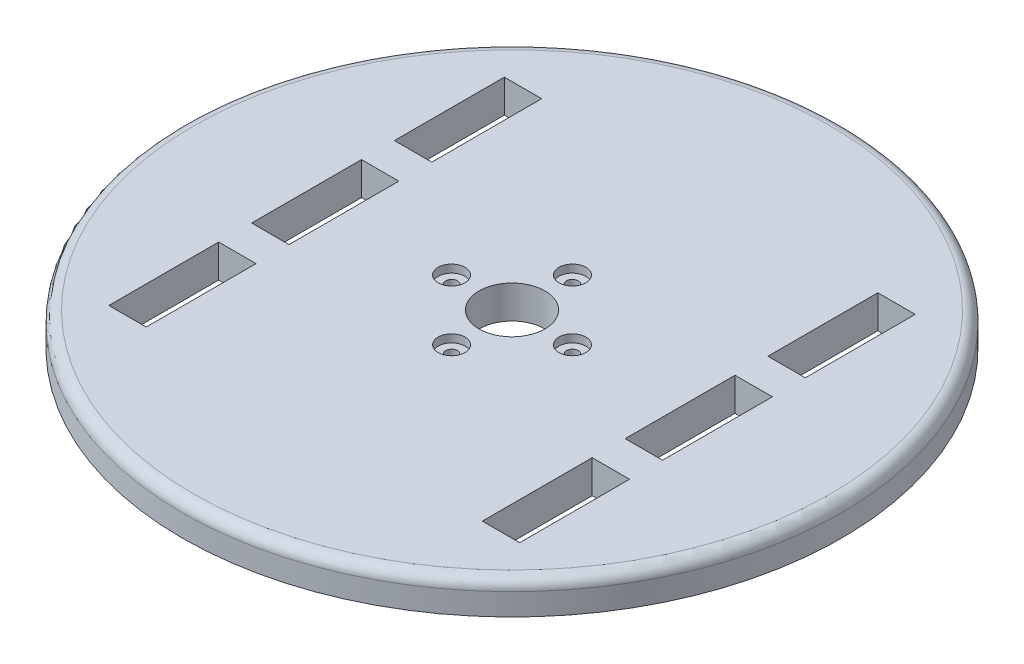
ISO-10303-21;
HEADER;
FILE_DESCRIPTION(('STEP AP214'),'2;1');
FILE_NAME('part.step','',(''),(''),'','','');
FILE_SCHEMA(('AUTOMOTIVE_DESIGN { 1 0 10303 214 1 1 1 1 }'));
ENDSEC;
DATA;
#1=APPLICATION_CONTEXT('core data for automotive mechanical design processes');
#2=APPLICATION_PROTOCOL_DEFINITION('international standard','automotive_design',2000,#1);
#3=PRODUCT_CONTEXT('',#1,'mechanical');
#4=PRODUCT('Part','Part','',(#3));
#5=PRODUCT_RELATED_PRODUCT_CATEGORY('part','',(#4));
#6=PRODUCT_DEFINITION_FORMATION('','',#4);
#7=PRODUCT_DEFINITION_CONTEXT('part definition',#1,'design');
#8=PRODUCT_DEFINITION('design','',#6,#7);
#9=PRODUCT_DEFINITION_SHAPE('','',#8);
#10=(LENGTH_UNIT() NAMED_UNIT(*) SI_UNIT(.MILLI.,.METRE.));
#11=(NAMED_UNIT(*) PLANE_ANGLE_UNIT() SI_UNIT($,.RADIAN.));
#12=(NAMED_UNIT(*) SI_UNIT($,.STERADIAN.) SOLID_ANGLE_UNIT());
#13=UNCERTAINTY_MEASURE_WITH_UNIT(LENGTH_MEASURE(1.E-05),#10,'distance_accuracy_value','');
#14=(GEOMETRIC_REPRESENTATION_CONTEXT(3) GLOBAL_UNCERTAINTY_ASSIGNED_CONTEXT((#13)) GLOBAL_UNIT_ASSIGNED_CONTEXT((#10,
#11,#12)) REPRESENTATION_CONTEXT('',''));
#15=CARTESIAN_POINT('',(0.,0.,0.));
#16=DIRECTION('',(0.,0.,1.));
#17=DIRECTION('',(1.,0.,0.));
#18=AXIS2_PLACEMENT_3D('',#15,#16,#17);
#19=CARTESIAN_POINT('',(0.,15.,0.));
#20=DIRECTION('',(0.,1.,0.));
#21=DIRECTION('',(0.,0.,1.));
#22=AXIS2_PLACEMENT_3D('',#19,#20,#21);
#23=PLANE('',#22);
#24=CARTESIAN_POINT('',(0.,15.,0.));
#25=DIRECTION('',(0.,1.,0.));
#26=DIRECTION('',(0.,0.,1.));
#27=AXIS2_PLACEMENT_3D('',#24,#25,#26);
#28=CIRCLE('',#27,145.);
#29=CARTESIAN_POINT('',(0.,15.,145.));
#30=VERTEX_POINT('',#29);
#31=EDGE_CURVE('E40',#30,#30,#28,.T.);
#32=ORIENTED_EDGE('',*,*,#31,.T.);
#33=EDGE_LOOP('',(#32));
#34=FACE_BOUND('',#33,.T.);
#35=DIRECTION('',(-1.,0.,0.));
#36=VECTOR('',#35,1.);
#37=CARTESIAN_POINT('',(93.5000000000007,15.,-40.));
#38=LINE('',#37,#36);
#39=CARTESIAN_POINT('',(93.5000000000007,15.,-40.));
#40=VERTEX_POINT('',#39);
#41=CARTESIAN_POINT('',(76.5000000000007,15.,-40.));
#42=VERTEX_POINT('',#41);
#43=EDGE_CURVE('E267',#40,#42,#38,.T.);
#44=ORIENTED_EDGE('',*,*,#43,.T.);
#45=DIRECTION('',(0.,0.,-1.));
#46=VECTOR('',#45,1.);
#47=CARTESIAN_POINT('',(76.5000000000007,15.,-90.));
#48=LINE('',#47,#46);
#49=CARTESIAN_POINT('',(76.5000000000007,15.,-90.));
#50=VERTEX_POINT('',#49);
#51=EDGE_CURVE('E270',#42,#50,#48,.T.);
#52=ORIENTED_EDGE('',*,*,#51,.T.);
#53=DIRECTION('',(1.,0.,0.));
#54=VECTOR('',#53,1.);
#55=CARTESIAN_POINT('',(93.5000000000007,15.,-90.));
#56=LINE('',#55,#54);
#57=CARTESIAN_POINT('',(93.5000000000007,15.,-90.));
#58=VERTEX_POINT('',#57);
#59=EDGE_CURVE('E47',#50,#58,#56,.T.);
#60=ORIENTED_EDGE('',*,*,#59,.T.);
#61=DIRECTION('',(0.,0.,1.));
#62=VECTOR('',#61,1.);
#63=CARTESIAN_POINT('',(93.5000000000007,15.,-90.));
#64=LINE('',#63,#62);
#65=EDGE_CURVE('E275',#58,#40,#64,.T.);
#66=ORIENTED_EDGE('',*,*,#65,.T.);
#67=EDGE_LOOP('',(#44,#52,#60,#66));
#68=FACE_BOUND('',#67,.T.);
#69=DIRECTION('',(0.,0.,-1.));
#70=VECTOR('',#69,1.);
#71=CARTESIAN_POINT('',(76.5,15.,40.));
#72=LINE('',#71,#70);
#73=CARTESIAN_POINT('',(76.5,15.,90.));
#74=VERTEX_POINT('',#73);
#75=CARTESIAN_POINT('',(76.5,15.,40.));
#76=VERTEX_POINT('',#75);
#77=EDGE_CURVE('E237',#74,#76,#72,.T.);
#78=ORIENTED_EDGE('',*,*,#77,.T.);
#79=DIRECTION('',(1.,0.,0.));
#80=VECTOR('',#79,1.);
#81=CARTESIAN_POINT('',(93.5,15.,40.));
#82=LINE('',#81,#80);
#83=CARTESIAN_POINT('',(93.5,15.,40.));
#84=VERTEX_POINT('',#83);
#85=EDGE_CURVE('E240',#76,#84,#82,.T.);
#86=ORIENTED_EDGE('',*,*,#85,.T.);
#87=DIRECTION('',(0.,0.,1.));
#88=VECTOR('',#87,1.);
#89=CARTESIAN_POINT('',(93.5,15.,40.));
#90=LINE('',#89,#88);
#91=CARTESIAN_POINT('',(93.5,15.,90.));
#92=VERTEX_POINT('',#91);
#93=EDGE_CURVE('E55',#84,#92,#90,.T.);
#94=ORIENTED_EDGE('',*,*,#93,.T.);
#95=DIRECTION('',(-1.,0.,0.));
#96=VECTOR('',#95,1.);
#97=CARTESIAN_POINT('',(93.5,15.,90.));
#98=LINE('',#97,#96);
#99=EDGE_CURVE('E245',#92,#74,#98,.T.);
#100=ORIENTED_EDGE('',*,*,#99,.T.);
#101=EDGE_LOOP('',(#78,#86,#94,#100));
#102=FACE_BOUND('',#101,.T.);
#103=DIRECTION('',(-1.,0.,0.));
#104=VECTOR('',#103,1.);
#105=CARTESIAN_POINT('',(-76.4999999999993,15.,-40.));
#106=LINE('',#105,#104);
#107=CARTESIAN_POINT('',(-76.4999999999993,15.,-40.));
#108=VERTEX_POINT('',#107);
#109=CARTESIAN_POINT('',(-93.4999999999993,15.,-40.));
#110=VERTEX_POINT('',#109);
#111=EDGE_CURVE('E197',#108,#110,#106,.T.);
#112=ORIENTED_EDGE('',*,*,#111,.T.);
#113=DIRECTION('',(0.,0.,-1.));
#114=VECTOR('',#113,1.);
#115=CARTESIAN_POINT('',(-93.4999999999993,15.,-90.));
#116=LINE('',#115,#114);
#117=CARTESIAN_POINT('',(-93.4999999999993,15.,-90.));
#118=VERTEX_POINT('',#117);
#119=EDGE_CURVE('E209',#110,#118,#116,.T.);
#120=ORIENTED_EDGE('',*,*,#119,.T.);
#121=DIRECTION('',(1.,0.,0.));
#122=VECTOR('',#121,1.);
#123=CARTESIAN_POINT('',(-76.4999999999993,15.,-90.));
#124=LINE('',#123,#122);
#125=CARTESIAN_POINT('',(-76.4999999999993,15.,-90.));
#126=VERTEX_POINT('',#125);
#127=EDGE_CURVE('E213',#118,#126,#124,.T.);
#128=ORIENTED_EDGE('',*,*,#127,.T.);
#129=DIRECTION('',(0.,0.,1.));
#130=VECTOR('',#129,1.);
#131=CARTESIAN_POINT('',(-76.4999999999993,15.,-90.));
#132=LINE('',#131,#130);
#133=EDGE_CURVE('E205',#126,#108,#132,.T.);
#134=ORIENTED_EDGE('',*,*,#133,.T.);
#135=EDGE_LOOP('',(#112,#120,#128,#134));
#136=FACE_BOUND('',#135,.T.);
#137=DIRECTION('',(0.,0.,-1.));
#138=VECTOR('',#137,1.);
#139=CARTESIAN_POINT('',(-93.5,15.,40.));
#140=LINE('',#139,#138);
#141=CARTESIAN_POINT('',(-93.5,15.,90.));
#142=VERTEX_POINT('',#141);
#143=CARTESIAN_POINT('',(-93.5,15.,40.));
#144=VERTEX_POINT('',#143);
#145=EDGE_CURVE('E330',#142,#144,#140,.T.);
#146=ORIENTED_EDGE('',*,*,#145,.T.);
#147=DIRECTION('',(1.,0.,0.));
#148=VECTOR('',#147,1.);
#149=CARTESIAN_POINT('',(-76.5,15.,40.));
#150=LINE('',#149,#148);
#151=CARTESIAN_POINT('',(-76.5,15.,40.));
#152=VERTEX_POINT('',#151);
#153=EDGE_CURVE('E333',#144,#152,#150,.T.);
#154=ORIENTED_EDGE('',*,*,#153,.T.);
#155=DIRECTION('',(0.,0.,1.));
#156=VECTOR('',#155,1.);
#157=CARTESIAN_POINT('',(-76.5,15.,40.));
#158=LINE('',#157,#156);
#159=CARTESIAN_POINT('',(-76.5,15.,90.));
#160=VERTEX_POINT('',#159);
#161=EDGE_CURVE('E337',#152,#160,#158,.T.);
#162=ORIENTED_EDGE('',*,*,#161,.T.);
#163=DIRECTION('',(-1.,0.,0.));
#164=VECTOR('',#163,1.);
#165=CARTESIAN_POINT('',(-76.5,15.,90.));
#166=LINE('',#165,#164);
#167=EDGE_CURVE('E340',#160,#142,#166,.T.);
#168=ORIENTED_EDGE('',*,*,#167,.T.);
#169=EDGE_LOOP('',(#146,#154,#162,#168));
#170=FACE_BOUND('',#169,.T.);
#171=DIRECTION('',(-1.,0.,0.));
#172=VECTOR('',#171,1.);
#173=CARTESIAN_POINT('',(93.5,15.,25.));
#174=LINE('',#173,#172);
#175=CARTESIAN_POINT('',(93.5,15.,25.));
#176=VERTEX_POINT('',#175);
#177=CARTESIAN_POINT('',(76.5,15.,25.));
#178=VERTEX_POINT('',#177);
#179=EDGE_CURVE('E296',#176,#178,#174,.T.);
#180=ORIENTED_EDGE('',*,*,#179,.T.);
#181=DIRECTION('',(0.,0.,-1.));
#182=VECTOR('',#181,1.);
#183=CARTESIAN_POINT('',(76.5,15.,-25.));
#184=LINE('',#183,#182);
#185=CARTESIAN_POINT('',(76.5,15.,-25.));
#186=VERTEX_POINT('',#185);
#187=EDGE_CURVE('E299',#178,#186,#184,.T.);
#188=ORIENTED_EDGE('',*,*,#187,.T.);
#189=DIRECTION('',(1.,0.,0.));
#190=VECTOR('',#189,1.);
#191=CARTESIAN_POINT('',(93.5,15.,-25.));
#192=LINE('',#191,#190);
#193=CARTESIAN_POINT('',(93.5,15.,-25.));
#194=VERTEX_POINT('',#193);
#195=EDGE_CURVE('E303',#186,#194,#192,.T.);
#196=ORIENTED_EDGE('',*,*,#195,.T.);
#197=DIRECTION('',(0.,0.,1.));
#198=VECTOR('',#197,1.);
#199=CARTESIAN_POINT('',(93.5,15.,-25.));
#200=LINE('',#199,#198);
#201=EDGE_CURVE('E306',#194,#176,#200,.T.);
#202=ORIENTED_EDGE('',*,*,#201,.T.);
#203=EDGE_LOOP('',(#180,#188,#196,#202));
#204=FACE_BOUND('',#203,.T.);
#205=DIRECTION('',(0.,0.,-1.));
#206=VECTOR('',#205,1.);
#207=CARTESIAN_POINT('',(-93.5,15.,-25.));
#208=LINE('',#207,#206);
#209=CARTESIAN_POINT('',(-93.5,15.,25.));
#210=VERTEX_POINT('',#209);
#211=CARTESIAN_POINT('',(-93.5,15.,-25.));
#212=VERTEX_POINT('',#211);
#213=EDGE_CURVE('E360',#210,#212,#208,.T.);
#214=ORIENTED_EDGE('',*,*,#213,.T.);
#215=DIRECTION('',(1.,0.,0.));
#216=VECTOR('',#215,1.);
#217=CARTESIAN_POINT('',(-76.5,15.,-25.));
#218=LINE('',#217,#216);
#219=CARTESIAN_POINT('',(-76.5,15.,-25.));
#220=VERTEX_POINT('',#219);
#221=EDGE_CURVE('E363',#212,#220,#218,.T.);
#222=ORIENTED_EDGE('',*,*,#221,.T.);
#223=DIRECTION('',(0.,0.,1.));
#224=VECTOR('',#223,1.);
#225=CARTESIAN_POINT('',(-76.5,15.,-25.));
#226=LINE('',#225,#224);
#227=CARTESIAN_POINT('',(-76.5,15.,25.));
#228=VERTEX_POINT('',#227);
#229=EDGE_CURVE('E367',#220,#228,#226,.T.);
#230=ORIENTED_EDGE('',*,*,#229,.T.);
#231=DIRECTION('',(-1.,0.,0.));
#232=VECTOR('',#231,1.);
#233=CARTESIAN_POINT('',(-76.5,15.,25.));
#234=LINE('',#233,#232);
#235=EDGE_CURVE('E370',#228,#210,#234,.T.);
#236=ORIENTED_EDGE('',*,*,#235,.T.);
#237=EDGE_LOOP('',(#214,#222,#230,#236));
#238=FACE_BOUND('',#237,.T.);
#239=CARTESIAN_POINT('',(-27.5,15.,-2.88047210454558E-13));
#240=DIRECTION('',(0.,1.,0.));
#241=DIRECTION('',(0.,0.,1.));
#242=AXIS2_PLACEMENT_3D('',#239,#240,#241);
#243=CIRCLE('',#242,6.12);
#244=CARTESIAN_POINT('',(-27.5,15.,6.11999999999971));
#245=VERTEX_POINT('',#244);
#246=EDGE_CURVE('E385',#245,#245,#243,.T.);
#247=ORIENTED_EDGE('',*,*,#246,.F.);
#248=EDGE_LOOP('',(#247));
#249=FACE_BOUND('',#248,.T.);
#250=CARTESIAN_POINT('',(0.,15.,27.5));
#251=DIRECTION('',(0.,1.,0.));
#252=DIRECTION('',(0.,0.,1.));
#253=AXIS2_PLACEMENT_3D('',#250,#251,#252);
#254=CIRCLE('',#253,6.12);
#255=CARTESIAN_POINT('',(0.,15.,33.62));
#256=VERTEX_POINT('',#255);
#257=EDGE_CURVE('E403',#256,#256,#254,.T.);
#258=ORIENTED_EDGE('',*,*,#257,.F.);
#259=EDGE_LOOP('',(#258));
#260=FACE_BOUND('',#259,.T.);
#261=CARTESIAN_POINT('',(27.5,15.,0.));
#262=DIRECTION('',(0.,1.,0.));
#263=DIRECTION('',(0.,0.,1.));
#264=AXIS2_PLACEMENT_3D('',#261,#262,#263);
#265=CIRCLE('',#264,6.12);
#266=CARTESIAN_POINT('',(27.5,15.,6.1200000000001));
#267=VERTEX_POINT('',#266);
#268=EDGE_CURVE('E415',#267,#267,#265,.T.);
#269=ORIENTED_EDGE('',*,*,#268,.F.);
#270=EDGE_LOOP('',(#269));
#271=FACE_BOUND('',#270,.T.);
#272=CARTESIAN_POINT('',(0.,15.,-27.5));
#273=DIRECTION('',(0.,1.,0.));
#274=DIRECTION('',(0.,0.,1.));
#275=AXIS2_PLACEMENT_3D('',#272,#273,#274);
#276=CIRCLE('',#275,6.12);
#277=CARTESIAN_POINT('',(0.,15.,-21.38));
#278=VERTEX_POINT('',#277);
#279=EDGE_CURVE('E427',#278,#278,#276,.T.);
#280=ORIENTED_EDGE('',*,*,#279,.F.);
#281=EDGE_LOOP('',(#280));
#282=FACE_BOUND('',#281,.T.);
#283=CARTESIAN_POINT('',(0.,15.,0.));
#284=DIRECTION('',(0.,1.,0.));
#285=DIRECTION('',(0.,0.,1.));
#286=AXIS2_PLACEMENT_3D('',#283,#284,#285);
#287=CIRCLE('',#286,15.);
#288=CARTESIAN_POINT('',(0.,15.,15.));
#289=VERTEX_POINT('',#288);
#290=EDGE_CURVE('E440',#289,#289,#287,.T.);
#291=ORIENTED_EDGE('',*,*,#290,.F.);
#292=EDGE_LOOP('',(#291));
#293=FACE_BOUND('',#292,.T.);
#294=ADVANCED_FACE('F32',(#34,#68,#102,#136,#170,#204,#238,#249,#260,#271,#282,#293),#23,.T.);
#295=CARTESIAN_POINT('',(0.,0.,0.));
#296=DIRECTION('',(0.,1.,0.));
#297=DIRECTION('',(0.,0.,1.));
#298=AXIS2_PLACEMENT_3D('',#295,#296,#297);
#299=PLANE('',#298);
#300=DIRECTION('',(0.,0.,-1.));
#301=VECTOR('',#300,1.);
#302=CARTESIAN_POINT('',(76.5000000000007,0.,-90.));
#303=LINE('',#302,#301);
#304=CARTESIAN_POINT('',(76.5000000000007,0.,-40.));
#305=VERTEX_POINT('',#304);
#306=CARTESIAN_POINT('',(76.5000000000007,0.,-90.));
#307=VERTEX_POINT('',#306);
#308=EDGE_CURVE('E281',#305,#307,#303,.T.);
#309=ORIENTED_EDGE('',*,*,#308,.F.);
#310=DIRECTION('',(-1.,0.,0.));
#311=VECTOR('',#310,1.);
#312=CARTESIAN_POINT('',(93.5000000000007,0.,-40.));
#313=LINE('',#312,#311);
#314=CARTESIAN_POINT('',(93.5000000000007,0.,-40.));
#315=VERTEX_POINT('',#314);
#316=EDGE_CURVE('E279',#315,#305,#313,.T.);
#317=ORIENTED_EDGE('',*,*,#316,.F.);
#318=DIRECTION('',(0.,0.,1.));
#319=VECTOR('',#318,1.);
#320=CARTESIAN_POINT('',(93.5000000000007,0.,-90.));
#321=LINE('',#320,#319);
#322=CARTESIAN_POINT('',(93.5000000000007,0.,-90.));
#323=VERTEX_POINT('',#322);
#324=EDGE_CURVE('E271',#323,#315,#321,.T.);
#325=ORIENTED_EDGE('',*,*,#324,.F.);
#326=DIRECTION('',(1.,0.,0.));
#327=VECTOR('',#326,1.);
#328=CARTESIAN_POINT('',(93.5000000000007,0.,-90.));
#329=LINE('',#328,#327);
#330=EDGE_CURVE('E284',#307,#323,#329,.T.);
#331=ORIENTED_EDGE('',*,*,#330,.F.);
#332=EDGE_LOOP('',(#309,#317,#325,#331));
#333=FACE_BOUND('',#332,.T.);
#334=DIRECTION('',(1.,0.,0.));
#335=VECTOR('',#334,1.);
#336=CARTESIAN_POINT('',(93.5,0.,40.));
#337=LINE('',#336,#335);
#338=CARTESIAN_POINT('',(76.5,0.,40.));
#339=VERTEX_POINT('',#338);
#340=CARTESIAN_POINT('',(93.5,0.,40.));
#341=VERTEX_POINT('',#340);
#342=EDGE_CURVE('E251',#339,#341,#337,.T.);
#343=ORIENTED_EDGE('',*,*,#342,.F.);
#344=DIRECTION('',(0.,0.,-1.));
#345=VECTOR('',#344,1.);
#346=CARTESIAN_POINT('',(76.5,0.,40.));
#347=LINE('',#346,#345);
#348=CARTESIAN_POINT('',(76.5,0.,90.));
#349=VERTEX_POINT('',#348);
#350=EDGE_CURVE('E249',#349,#339,#347,.T.);
#351=ORIENTED_EDGE('',*,*,#350,.F.);
#352=DIRECTION('',(-1.,0.,0.));
#353=VECTOR('',#352,1.);
#354=CARTESIAN_POINT('',(93.5,0.,90.));
#355=LINE('',#354,#353);
#356=CARTESIAN_POINT('',(93.5,0.,90.));
#357=VERTEX_POINT('',#356);
#358=EDGE_CURVE('E241',#357,#349,#355,.T.);
#359=ORIENTED_EDGE('',*,*,#358,.F.);
#360=DIRECTION('',(0.,0.,1.));
#361=VECTOR('',#360,1.);
#362=CARTESIAN_POINT('',(93.5,0.,40.));
#363=LINE('',#362,#361);
#364=EDGE_CURVE('E255',#341,#357,#363,.T.);
#365=ORIENTED_EDGE('',*,*,#364,.F.);
#366=EDGE_LOOP('',(#343,#351,#359,#365));
#367=FACE_BOUND('',#366,.T.);
#368=DIRECTION('',(0.,0.,-1.));
#369=VECTOR('',#368,1.);
#370=CARTESIAN_POINT('',(-93.4999999999993,0.,-90.));
#371=LINE('',#370,#369);
#372=CARTESIAN_POINT('',(-93.4999999999993,0.,-40.));
#373=VERTEX_POINT('',#372);
#374=CARTESIAN_POINT('',(-93.4999999999993,0.,-90.));
#375=VERTEX_POINT('',#374);
#376=EDGE_CURVE('E226',#373,#375,#371,.T.);
#377=ORIENTED_EDGE('',*,*,#376,.F.);
#378=DIRECTION('',(-1.,0.,0.));
#379=VECTOR('',#378,1.);
#380=CARTESIAN_POINT('',(-76.4999999999993,0.,-40.));
#381=LINE('',#380,#379);
#382=CARTESIAN_POINT('',(-76.4999999999993,0.,-40.));
#383=VERTEX_POINT('',#382);
#384=EDGE_CURVE('E200',#383,#373,#381,.T.);
#385=ORIENTED_EDGE('',*,*,#384,.F.);
#386=DIRECTION('',(0.,0.,1.));
#387=VECTOR('',#386,1.);
#388=CARTESIAN_POINT('',(-76.4999999999993,0.,-90.));
#389=LINE('',#388,#387);
#390=CARTESIAN_POINT('',(-76.4999999999993,0.,-90.));
#391=VERTEX_POINT('',#390);
#392=EDGE_CURVE('E217',#391,#383,#389,.T.);
#393=ORIENTED_EDGE('',*,*,#392,.F.);
#394=DIRECTION('',(1.,0.,0.));
#395=VECTOR('',#394,1.);
#396=CARTESIAN_POINT('',(-76.4999999999993,0.,-90.));
#397=LINE('',#396,#395);
#398=EDGE_CURVE('E220',#375,#391,#397,.T.);
#399=ORIENTED_EDGE('',*,*,#398,.F.);
#400=EDGE_LOOP('',(#377,#385,#393,#399));
#401=FACE_BOUND('',#400,.T.);
#402=DIRECTION('',(1.,0.,0.));
#403=VECTOR('',#402,1.);
#404=CARTESIAN_POINT('',(-76.5,0.,40.));
#405=LINE('',#404,#403);
#406=CARTESIAN_POINT('',(-93.5,0.,40.));
#407=VERTEX_POINT('',#406);
#408=CARTESIAN_POINT('',(-76.5,0.,40.));
#409=VERTEX_POINT('',#408);
#410=EDGE_CURVE('E345',#407,#409,#405,.T.);
#411=ORIENTED_EDGE('',*,*,#410,.F.);
#412=DIRECTION('',(0.,0.,-1.));
#413=VECTOR('',#412,1.);
#414=CARTESIAN_POINT('',(-93.5,0.,40.));
#415=LINE('',#414,#413);
#416=CARTESIAN_POINT('',(-93.5,0.,90.));
#417=VERTEX_POINT('',#416);
#418=EDGE_CURVE('E233',#417,#407,#415,.T.);
#419=ORIENTED_EDGE('',*,*,#418,.F.);
#420=DIRECTION('',(-1.,0.,0.));
#421=VECTOR('',#420,1.);
#422=CARTESIAN_POINT('',(-76.5,0.,90.));
#423=LINE('',#422,#421);
#424=CARTESIAN_POINT('',(-76.5,0.,90.));
#425=VERTEX_POINT('',#424);
#426=EDGE_CURVE('E334',#425,#417,#423,.T.);
#427=ORIENTED_EDGE('',*,*,#426,.F.);
#428=DIRECTION('',(0.,0.,1.));
#429=VECTOR('',#428,1.);
#430=CARTESIAN_POINT('',(-76.5,0.,40.));
#431=LINE('',#430,#429);
#432=EDGE_CURVE('E348',#409,#425,#431,.T.);
#433=ORIENTED_EDGE('',*,*,#432,.F.);
#434=EDGE_LOOP('',(#411,#419,#427,#433));
#435=FACE_BOUND('',#434,.T.);
#436=DIRECTION('',(0.,0.,-1.));
#437=VECTOR('',#436,1.);
#438=CARTESIAN_POINT('',(76.5,0.,-25.));
#439=LINE('',#438,#437);
#440=CARTESIAN_POINT('',(76.5,0.,25.));
#441=VERTEX_POINT('',#440);
#442=CARTESIAN_POINT('',(76.5,0.,-25.));
#443=VERTEX_POINT('',#442);
#444=EDGE_CURVE('E312',#441,#443,#439,.T.);
#445=ORIENTED_EDGE('',*,*,#444,.F.);
#446=DIRECTION('',(-1.,0.,0.));
#447=VECTOR('',#446,1.);
#448=CARTESIAN_POINT('',(93.5,0.,25.));
#449=LINE('',#448,#447);
#450=CARTESIAN_POINT('',(93.5,0.,25.));
#451=VERTEX_POINT('',#450);
#452=EDGE_CURVE('E310',#451,#441,#449,.T.);
#453=ORIENTED_EDGE('',*,*,#452,.F.);
#454=DIRECTION('',(0.,0.,1.));
#455=VECTOR('',#454,1.);
#456=CARTESIAN_POINT('',(93.5,0.,-25.));
#457=LINE('',#456,#455);
#458=CARTESIAN_POINT('',(93.5,0.,-25.));
#459=VERTEX_POINT('',#458);
#460=EDGE_CURVE('E300',#459,#451,#457,.T.);
#461=ORIENTED_EDGE('',*,*,#460,.F.);
#462=DIRECTION('',(1.,0.,0.));
#463=VECTOR('',#462,1.);
#464=CARTESIAN_POINT('',(93.5,0.,-25.));
#465=LINE('',#464,#463);
#466=EDGE_CURVE('E316',#443,#459,#465,.T.);
#467=ORIENTED_EDGE('',*,*,#466,.F.);
#468=EDGE_LOOP('',(#445,#453,#461,#467));
#469=FACE_BOUND('',#468,.T.);
#470=DIRECTION('',(1.,0.,0.));
#471=VECTOR('',#470,1.);
#472=CARTESIAN_POINT('',(-76.5,0.,-25.));
#473=LINE('',#472,#471);
#474=CARTESIAN_POINT('',(-93.5,0.,-25.));
#475=VERTEX_POINT('',#474);
#476=CARTESIAN_POINT('',(-76.5,0.,-25.));
#477=VERTEX_POINT('',#476);
#478=EDGE_CURVE('E375',#475,#477,#473,.T.);
#479=ORIENTED_EDGE('',*,*,#478,.F.);
#480=DIRECTION('',(0.,0.,-1.));
#481=VECTOR('',#480,1.);
#482=CARTESIAN_POINT('',(-93.5,0.,-25.));
#483=LINE('',#482,#481);
#484=CARTESIAN_POINT('',(-93.5,0.,25.));
#485=VERTEX_POINT('',#484);
#486=EDGE_CURVE('E323',#485,#475,#483,.T.);
#487=ORIENTED_EDGE('',*,*,#486,.F.);
#488=DIRECTION('',(-1.,0.,0.));
#489=VECTOR('',#488,1.);
#490=CARTESIAN_POINT('',(-76.5,0.,25.));
#491=LINE('',#490,#489);
#492=CARTESIAN_POINT('',(-76.5,0.,25.));
#493=VERTEX_POINT('',#492);
#494=EDGE_CURVE('E364',#493,#485,#491,.T.);
#495=ORIENTED_EDGE('',*,*,#494,.F.);
#496=DIRECTION('',(0.,0.,1.));
#497=VECTOR('',#496,1.);
#498=CARTESIAN_POINT('',(-76.5,0.,-25.));
#499=LINE('',#498,#497);
#500=EDGE_CURVE('E378',#477,#493,#499,.T.);
#501=ORIENTED_EDGE('',*,*,#500,.F.);
#502=EDGE_LOOP('',(#479,#487,#495,#501));
#503=FACE_BOUND('',#502,.T.);
#504=CARTESIAN_POINT('',(-27.5,0.,-2.88047210454558E-13));
#505=DIRECTION('',(0.,1.,0.));
#506=DIRECTION('',(0.,0.,1.));
#507=AXIS2_PLACEMENT_3D('',#504,#505,#506);
#508=CIRCLE('',#507,2.65);
#509=CARTESIAN_POINT('',(-27.5,0.,2.64999999999972));
#510=VERTEX_POINT('',#509);
#511=EDGE_CURVE('E400',#510,#510,#508,.T.);
#512=ORIENTED_EDGE('',*,*,#511,.T.);
#513=EDGE_LOOP('',(#512));
#514=FACE_BOUND('',#513,.T.);
#515=CARTESIAN_POINT('',(0.,0.,27.5));
#516=DIRECTION('',(0.,1.,0.));
#517=DIRECTION('',(0.,0.,1.));
#518=AXIS2_PLACEMENT_3D('',#515,#516,#517);
#519=CIRCLE('',#518,2.65);
#520=CARTESIAN_POINT('',(0.,0.,30.15));
#521=VERTEX_POINT('',#520);
#522=EDGE_CURVE('E412',#521,#521,#519,.T.);
#523=ORIENTED_EDGE('',*,*,#522,.T.);
#524=EDGE_LOOP('',(#523));
#525=FACE_BOUND('',#524,.T.);
#526=CARTESIAN_POINT('',(27.5,0.,0.));
#527=DIRECTION('',(0.,1.,0.));
#528=DIRECTION('',(0.,0.,1.));
#529=AXIS2_PLACEMENT_3D('',#526,#527,#528);
#530=CIRCLE('',#529,2.65);
#531=CARTESIAN_POINT('',(27.5,0.,2.6500000000001));
#532=VERTEX_POINT('',#531);
#533=EDGE_CURVE('E424',#532,#532,#530,.T.);
#534=ORIENTED_EDGE('',*,*,#533,.T.);
#535=EDGE_LOOP('',(#534));
#536=FACE_BOUND('',#535,.T.);
#537=CARTESIAN_POINT('',(0.,0.,-27.5));
#538=DIRECTION('',(0.,1.,0.));
#539=DIRECTION('',(0.,0.,1.));
#540=AXIS2_PLACEMENT_3D('',#537,#538,#539);
#541=CIRCLE('',#540,2.65);
#542=CARTESIAN_POINT('',(0.,0.,-24.85));
#543=VERTEX_POINT('',#542);
#544=EDGE_CURVE('E436',#543,#543,#541,.T.);
#545=ORIENTED_EDGE('',*,*,#544,.T.);
#546=EDGE_LOOP('',(#545));
#547=FACE_BOUND('',#546,.T.);
#548=CARTESIAN_POINT('',(0.,0.,0.));
#549=DIRECTION('',(0.,1.,0.));
#550=DIRECTION('',(0.,0.,1.));
#551=AXIS2_PLACEMENT_3D('',#548,#549,#550);
#552=CIRCLE('',#551,150.);
#553=CARTESIAN_POINT('',(0.,0.,150.));
#554=VERTEX_POINT('',#553);
#555=EDGE_CURVE('E443',#554,#554,#552,.T.);
#556=ORIENTED_EDGE('',*,*,#555,.F.);
#557=EDGE_LOOP('',(#556));
#558=FACE_BOUND('',#557,.T.);
#559=CARTESIAN_POINT('',(0.,0.,0.));
#560=DIRECTION('',(0.,1.,0.));
#561=DIRECTION('',(0.,0.,1.));
#562=AXIS2_PLACEMENT_3D('',#559,#560,#561);
#563=CIRCLE('',#562,15.);
#564=CARTESIAN_POINT('',(0.,0.,15.));
#565=VERTEX_POINT('',#564);
#566=EDGE_CURVE('E439',#565,#565,#563,.T.);
#567=ORIENTED_EDGE('',*,*,#566,.T.);
#568=EDGE_LOOP('',(#567));
#569=FACE_BOUND('',#568,.T.);
#570=ADVANCED_FACE('F463',(#333,#367,#401,#435,#469,#503,#514,#525,#536,#547,#558,#569),#299,.F.);
#571=CARTESIAN_POINT('',(0.,15.,0.));
#572=DIRECTION('',(0.,-1.,0.));
#573=DIRECTION('',(0.,0.,-1.));
#574=AXIS2_PLACEMENT_3D('',#571,#572,#573);
#575=CYLINDRICAL_SURFACE('',#574,150.);
#576=CARTESIAN_POINT('',(0.,10.,0.));
#577=DIRECTION('',(0.,1.,0.));
#578=DIRECTION('',(0.,0.,1.));
#579=AXIS2_PLACEMENT_3D('',#576,#577,#578);
#580=CIRCLE('',#579,150.);
#581=CARTESIAN_POINT('',(0.,10.,150.));
#582=VERTEX_POINT('',#581);
#583=EDGE_CURVE('E11',#582,#582,#580,.F.);
#584=ORIENTED_EDGE('',*,*,#583,.T.);
#585=EDGE_LOOP('',(#584));
#586=FACE_BOUND('',#585,.T.);
#587=ORIENTED_EDGE('',*,*,#555,.T.);
#588=EDGE_LOOP('',(#587));
#589=FACE_BOUND('',#588,.T.);
#590=ADVANCED_FACE('F468',(#586,#589),#575,.T.);
#591=CARTESIAN_POINT('',(0.,15.,0.));
#592=DIRECTION('',(0.,-1.,0.));
#593=DIRECTION('',(0.,0.,-1.));
#594=AXIS2_PLACEMENT_3D('',#591,#592,#593);
#595=CYLINDRICAL_SURFACE('',#594,15.);
#596=ORIENTED_EDGE('',*,*,#290,.T.);
#597=EDGE_LOOP('',(#596));
#598=FACE_BOUND('',#597,.T.);
#599=ORIENTED_EDGE('',*,*,#566,.F.);
#600=EDGE_LOOP('',(#599));
#601=FACE_BOUND('',#600,.T.);
#602=ADVANCED_FACE('F472',(#598,#601),#595,.F.);
#603=CARTESIAN_POINT('',(0.,15.,-27.5));
#604=DIRECTION('',(0.,1.,0.));
#605=DIRECTION('',(0.,0.,1.));
#606=AXIS2_PLACEMENT_3D('',#603,#604,#605);
#607=CYLINDRICAL_SURFACE('',#606,2.65);
#608=ORIENTED_EDGE('',*,*,#544,.F.);
#609=EDGE_LOOP('',(#608));
#610=FACE_BOUND('',#609,.T.);
#611=CARTESIAN_POINT('',(0.,11.42,-27.5));
#612=DIRECTION('',(0.,1.,0.));
#613=DIRECTION('',(0.,0.,1.));
#614=AXIS2_PLACEMENT_3D('',#611,#612,#613);
#615=CIRCLE('',#614,2.65000000000001);
#616=CARTESIAN_POINT('',(0.,11.42,-24.85));
#617=VERTEX_POINT('',#616);
#618=EDGE_CURVE('E433',#617,#617,#615,.T.);
#619=ORIENTED_EDGE('',*,*,#618,.T.);
#620=EDGE_LOOP('',(#619));
#621=FACE_BOUND('',#620,.T.);
#622=ADVANCED_FACE('F479',(#610,#621),#607,.F.);
#623=CARTESIAN_POINT('',(2.65000000000001,11.42,-27.5));
#624=DIRECTION('',(0.,-1.,0.));
#625=DIRECTION('',(0.,0.,-1.));
#626=AXIS2_PLACEMENT_3D('',#623,#624,#625);
#627=PLANE('',#626);
#628=ORIENTED_EDGE('',*,*,#618,.F.);
#629=EDGE_LOOP('',(#628));
#630=FACE_BOUND('',#629,.T.);
#631=CARTESIAN_POINT('',(0.,11.42,-27.5));
#632=DIRECTION('',(0.,1.,0.));
#633=DIRECTION('',(0.,0.,1.));
#634=AXIS2_PLACEMENT_3D('',#631,#632,#633);
#635=CIRCLE('',#634,6.12);
#636=CARTESIAN_POINT('',(0.,11.42,-21.38));
#637=VERTEX_POINT('',#636);
#638=EDGE_CURVE('E430',#637,#637,#635,.T.);
#639=ORIENTED_EDGE('',*,*,#638,.T.);
#640=EDGE_LOOP('',(#639));
#641=FACE_BOUND('',#640,.T.);
#642=ADVANCED_FACE('F490',(#630,#641),#627,.F.);
#643=CARTESIAN_POINT('',(0.,15.,-27.5));
#644=DIRECTION('',(0.,1.,0.));
#645=DIRECTION('',(0.,0.,1.));
#646=AXIS2_PLACEMENT_3D('',#643,#644,#645);
#647=CYLINDRICAL_SURFACE('',#646,6.12);
#648=ORIENTED_EDGE('',*,*,#638,.F.);
#649=EDGE_LOOP('',(#648));
#650=FACE_BOUND('',#649,.T.);
#651=ORIENTED_EDGE('',*,*,#279,.T.);
#652=EDGE_LOOP('',(#651));
#653=FACE_BOUND('',#652,.T.);
#654=ADVANCED_FACE('F497',(#650,#653),#647,.F.);
#655=CARTESIAN_POINT('',(27.5,15.,0.));
#656=DIRECTION('',(0.,1.,0.));
#657=DIRECTION('',(0.,0.,1.));
#658=AXIS2_PLACEMENT_3D('',#655,#656,#657);
#659=CYLINDRICAL_SURFACE('',#658,2.65);
#660=ORIENTED_EDGE('',*,*,#533,.F.);
#661=EDGE_LOOP('',(#660));
#662=FACE_BOUND('',#661,.T.);
#663=CARTESIAN_POINT('',(27.5,11.42,0.));
#664=DIRECTION('',(0.,1.,0.));
#665=DIRECTION('',(0.,0.,1.));
#666=AXIS2_PLACEMENT_3D('',#663,#664,#665);
#667=CIRCLE('',#666,2.65000000000001);
#668=CARTESIAN_POINT('',(27.5,11.42,2.6500000000001));
#669=VERTEX_POINT('',#668);
#670=EDGE_CURVE('E421',#669,#669,#667,.T.);
#671=ORIENTED_EDGE('',*,*,#670,.T.);
#672=EDGE_LOOP('',(#671));
#673=FACE_BOUND('',#672,.T.);
#674=ADVANCED_FACE('F505',(#662,#673),#659,.F.);
#675=CARTESIAN_POINT('',(30.15,11.42,0.));
#676=DIRECTION('',(0.,-1.,0.));
#677=DIRECTION('',(0.,0.,-1.));
#678=AXIS2_PLACEMENT_3D('',#675,#676,#677);
#679=PLANE('',#678);
#680=ORIENTED_EDGE('',*,*,#670,.F.);
#681=EDGE_LOOP('',(#680));
#682=FACE_BOUND('',#681,.T.);
#683=CARTESIAN_POINT('',(27.5,11.42,0.));
#684=DIRECTION('',(0.,1.,0.));
#685=DIRECTION('',(0.,0.,1.));
#686=AXIS2_PLACEMENT_3D('',#683,#684,#685);
#687=CIRCLE('',#686,6.12);
#688=CARTESIAN_POINT('',(27.5,11.42,6.1200000000001));
#689=VERTEX_POINT('',#688);
#690=EDGE_CURVE('E418',#689,#689,#687,.T.);
#691=ORIENTED_EDGE('',*,*,#690,.T.);
#692=EDGE_LOOP('',(#691));
#693=FACE_BOUND('',#692,.T.);
#694=ADVANCED_FACE('F509',(#682,#693),#679,.F.);
#695=CARTESIAN_POINT('',(27.5,15.,0.));
#696=DIRECTION('',(0.,1.,0.));
#697=DIRECTION('',(0.,0.,1.));
#698=AXIS2_PLACEMENT_3D('',#695,#696,#697);
#699=CYLINDRICAL_SURFACE('',#698,6.12);
#700=ORIENTED_EDGE('',*,*,#690,.F.);
#701=EDGE_LOOP('',(#700));
#702=FACE_BOUND('',#701,.T.);
#703=ORIENTED_EDGE('',*,*,#268,.T.);
#704=EDGE_LOOP('',(#703));
#705=FACE_BOUND('',#704,.T.);
#706=ADVANCED_FACE('F513',(#702,#705),#699,.F.);
#707=CARTESIAN_POINT('',(0.,15.,27.5));
#708=DIRECTION('',(0.,1.,0.));
#709=DIRECTION('',(0.,0.,1.));
#710=AXIS2_PLACEMENT_3D('',#707,#708,#709);
#711=CYLINDRICAL_SURFACE('',#710,2.65);
#712=ORIENTED_EDGE('',*,*,#522,.F.);
#713=EDGE_LOOP('',(#712));
#714=FACE_BOUND('',#713,.T.);
#715=CARTESIAN_POINT('',(0.,11.42,27.5));
#716=DIRECTION('',(0.,1.,0.));
#717=DIRECTION('',(0.,0.,1.));
#718=AXIS2_PLACEMENT_3D('',#715,#716,#717);
#719=CIRCLE('',#718,2.65000000000001);
#720=CARTESIAN_POINT('',(0.,11.42,30.15));
#721=VERTEX_POINT('',#720);
#722=EDGE_CURVE('E409',#721,#721,#719,.T.);
#723=ORIENTED_EDGE('',*,*,#722,.T.);
#724=EDGE_LOOP('',(#723));
#725=FACE_BOUND('',#724,.T.);
#726=ADVANCED_FACE('F517',(#714,#725),#711,.F.);
#727=CARTESIAN_POINT('',(2.65000000000001,11.42,27.5));
#728=DIRECTION('',(0.,-1.,0.));
#729=DIRECTION('',(0.,0.,-1.));
#730=AXIS2_PLACEMENT_3D('',#727,#728,#729);
#731=PLANE('',#730);
#732=ORIENTED_EDGE('',*,*,#722,.F.);
#733=EDGE_LOOP('',(#732));
#734=FACE_BOUND('',#733,.T.);
#735=CARTESIAN_POINT('',(0.,11.42,27.5));
#736=DIRECTION('',(0.,1.,0.));
#737=DIRECTION('',(0.,0.,1.));
#738=AXIS2_PLACEMENT_3D('',#735,#736,#737);
#739=CIRCLE('',#738,6.12);
#740=CARTESIAN_POINT('',(0.,11.42,33.62));
#741=VERTEX_POINT('',#740);
#742=EDGE_CURVE('E406',#741,#741,#739,.T.);
#743=ORIENTED_EDGE('',*,*,#742,.T.);
#744=EDGE_LOOP('',(#743));
#745=FACE_BOUND('',#744,.T.);
#746=ADVANCED_FACE('F521',(#734,#745),#731,.F.);
#747=CARTESIAN_POINT('',(0.,15.,27.5));
#748=DIRECTION('',(0.,1.,0.));
#749=DIRECTION('',(0.,0.,1.));
#750=AXIS2_PLACEMENT_3D('',#747,#748,#749);
#751=CYLINDRICAL_SURFACE('',#750,6.12);
#752=ORIENTED_EDGE('',*,*,#742,.F.);
#753=EDGE_LOOP('',(#752));
#754=FACE_BOUND('',#753,.T.);
#755=ORIENTED_EDGE('',*,*,#257,.T.);
#756=EDGE_LOOP('',(#755));
#757=FACE_BOUND('',#756,.T.);
#758=ADVANCED_FACE('F525',(#754,#757),#751,.F.);
#759=CARTESIAN_POINT('',(-27.5,15.,-2.88047210454558E-13));
#760=DIRECTION('',(0.,1.,0.));
#761=DIRECTION('',(0.,0.,1.));
#762=AXIS2_PLACEMENT_3D('',#759,#760,#761);
#763=CYLINDRICAL_SURFACE('',#762,2.65);
#764=ORIENTED_EDGE('',*,*,#511,.F.);
#765=EDGE_LOOP('',(#764));
#766=FACE_BOUND('',#765,.T.);
#767=CARTESIAN_POINT('',(-27.5,11.42,-2.88047210454558E-13));
#768=DIRECTION('',(0.,1.,0.));
#769=DIRECTION('',(0.,0.,1.));
#770=AXIS2_PLACEMENT_3D('',#767,#768,#769);
#771=CIRCLE('',#770,2.65000000000001);
#772=CARTESIAN_POINT('',(-27.5,11.42,2.64999999999972));
#773=VERTEX_POINT('',#772);
#774=EDGE_CURVE('E397',#773,#773,#771,.T.);
#775=ORIENTED_EDGE('',*,*,#774,.T.);
#776=EDGE_LOOP('',(#775));
#777=FACE_BOUND('',#776,.T.);
#778=ADVANCED_FACE('F529',(#766,#777),#763,.F.);
#779=CARTESIAN_POINT('',(-24.85,11.42,-2.88047210454558E-13));
#780=DIRECTION('',(0.,-1.,0.));
#781=DIRECTION('',(0.,0.,-1.));
#782=AXIS2_PLACEMENT_3D('',#779,#780,#781);
#783=PLANE('',#782);
#784=ORIENTED_EDGE('',*,*,#774,.F.);
#785=EDGE_LOOP('',(#784));
#786=FACE_BOUND('',#785,.T.);
#787=CARTESIAN_POINT('',(-27.5,11.42,-2.88047210454558E-13));
#788=DIRECTION('',(0.,1.,0.));
#789=DIRECTION('',(0.,0.,1.));
#790=AXIS2_PLACEMENT_3D('',#787,#788,#789);
#791=CIRCLE('',#790,6.12);
#792=CARTESIAN_POINT('',(-27.5,11.42,6.11999999999971));
#793=VERTEX_POINT('',#792);
#794=EDGE_CURVE('E394',#793,#793,#791,.T.);
#795=ORIENTED_EDGE('',*,*,#794,.T.);
#796=EDGE_LOOP('',(#795));
#797=FACE_BOUND('',#796,.T.);
#798=ADVANCED_FACE('F533',(#786,#797),#783,.F.);
#799=CARTESIAN_POINT('',(-27.5,15.,-2.88047210454558E-13));
#800=DIRECTION('',(0.,1.,0.));
#801=DIRECTION('',(0.,0.,1.));
#802=AXIS2_PLACEMENT_3D('',#799,#800,#801);
#803=CYLINDRICAL_SURFACE('',#802,6.12);
#804=ORIENTED_EDGE('',*,*,#794,.F.);
#805=EDGE_LOOP('',(#804));
#806=FACE_BOUND('',#805,.T.);
#807=ORIENTED_EDGE('',*,*,#246,.T.);
#808=EDGE_LOOP('',(#807));
#809=FACE_BOUND('',#808,.T.);
#810=ADVANCED_FACE('F537',(#806,#809),#803,.F.);
#811=CARTESIAN_POINT('',(-93.5,15.,-25.));
#812=DIRECTION('',(-1.,0.,0.));
#813=DIRECTION('',(0.,0.,1.));
#814=AXIS2_PLACEMENT_3D('',#811,#812,#813);
#815=PLANE('',#814);
#816=ORIENTED_EDGE('',*,*,#486,.T.);
#817=DIRECTION('',(0.,-1.,0.));
#818=VECTOR('',#817,1.);
#819=CARTESIAN_POINT('',(-93.5,15.,-25.));
#820=LINE('',#819,#818);
#821=EDGE_CURVE('E373',#212,#475,#820,.T.);
#822=ORIENTED_EDGE('',*,*,#821,.F.);
#823=ORIENTED_EDGE('',*,*,#213,.F.);
#824=DIRECTION('',(0.,-1.,0.));
#825=VECTOR('',#824,1.);
#826=CARTESIAN_POINT('',(-93.5,15.,25.));
#827=LINE('',#826,#825);
#828=EDGE_CURVE('E383',#210,#485,#827,.T.);
#829=ORIENTED_EDGE('',*,*,#828,.T.);
#830=EDGE_LOOP('',(#816,#822,#823,#829));
#831=FACE_BOUND('',#830,.T.);
#832=ADVANCED_FACE('F541',(#831),#815,.F.);
#833=CARTESIAN_POINT('',(-76.5,15.,25.));
#834=DIRECTION('',(0.,0.,1.));
#835=DIRECTION('',(1.,0.,0.));
#836=AXIS2_PLACEMENT_3D('',#833,#834,#835);
#837=PLANE('',#836);
#838=ORIENTED_EDGE('',*,*,#494,.T.);
#839=ORIENTED_EDGE('',*,*,#828,.F.);
#840=ORIENTED_EDGE('',*,*,#235,.F.);
#841=DIRECTION('',(0.,-1.,0.));
#842=VECTOR('',#841,1.);
#843=CARTESIAN_POINT('',(-76.5,15.,25.));
#844=LINE('',#843,#842);
#845=EDGE_CURVE('E386',#228,#493,#844,.T.);
#846=ORIENTED_EDGE('',*,*,#845,.T.);
#847=EDGE_LOOP('',(#838,#839,#840,#846));
#848=FACE_BOUND('',#847,.T.);
#849=ADVANCED_FACE('F545',(#848),#837,.F.);
#850=CARTESIAN_POINT('',(-76.5,15.,-25.));
#851=DIRECTION('',(1.,0.,0.));
#852=DIRECTION('',(0.,0.,-1.));
#853=AXIS2_PLACEMENT_3D('',#850,#851,#852);
#854=PLANE('',#853);
#855=ORIENTED_EDGE('',*,*,#500,.T.);
#856=ORIENTED_EDGE('',*,*,#845,.F.);
#857=ORIENTED_EDGE('',*,*,#229,.F.);
#858=DIRECTION('',(0.,-1.,0.));
#859=VECTOR('',#858,1.);
#860=CARTESIAN_POINT('',(-76.5,15.,-25.));
#861=LINE('',#860,#859);
#862=EDGE_CURVE('E388',#220,#477,#861,.T.);
#863=ORIENTED_EDGE('',*,*,#862,.T.);
#864=EDGE_LOOP('',(#855,#856,#857,#863));
#865=FACE_BOUND('',#864,.T.);
#866=ADVANCED_FACE('F551',(#865),#854,.F.);
#867=CARTESIAN_POINT('',(-76.5,15.,-25.));
#868=DIRECTION('',(0.,0.,-1.));
#869=DIRECTION('',(-1.,0.,0.));
#870=AXIS2_PLACEMENT_3D('',#867,#868,#869);
#871=PLANE('',#870);
#872=ORIENTED_EDGE('',*,*,#478,.T.);
#873=ORIENTED_EDGE('',*,*,#862,.F.);
#874=ORIENTED_EDGE('',*,*,#221,.F.);
#875=ORIENTED_EDGE('',*,*,#821,.T.);
#876=EDGE_LOOP('',(#872,#873,#874,#875));
#877=FACE_BOUND('',#876,.T.);
#878=ADVANCED_FACE('F547',(#877),#871,.F.);
#879=CARTESIAN_POINT('',(93.5,15.,25.));
#880=DIRECTION('',(0.,0.,1.));
#881=DIRECTION('',(1.,0.,0.));
#882=AXIS2_PLACEMENT_3D('',#879,#880,#881);
#883=PLANE('',#882);
#884=ORIENTED_EDGE('',*,*,#452,.T.);
#885=DIRECTION('',(0.,-1.,0.));
#886=VECTOR('',#885,1.);
#887=CARTESIAN_POINT('',(76.5,15.,25.));
#888=LINE('',#887,#886);
#889=EDGE_CURVE('E309',#178,#441,#888,.T.);
#890=ORIENTED_EDGE('',*,*,#889,.F.);
#891=ORIENTED_EDGE('',*,*,#179,.F.);
#892=DIRECTION('',(0.,-1.,0.));
#893=VECTOR('',#892,1.);
#894=CARTESIAN_POINT('',(93.5,15.,25.));
#895=LINE('',#894,#893);
#896=EDGE_CURVE('E321',#176,#451,#895,.T.);
#897=ORIENTED_EDGE('',*,*,#896,.T.);
#898=EDGE_LOOP('',(#884,#890,#891,#897));
#899=FACE_BOUND('',#898,.T.);
#900=ADVANCED_FACE('F550',(#899),#883,.F.);
#901=CARTESIAN_POINT('',(93.5,15.,-25.));
#902=DIRECTION('',(1.,0.,0.));
#903=DIRECTION('',(0.,0.,-1.));
#904=AXIS2_PLACEMENT_3D('',#901,#902,#903);
#905=PLANE('',#904);
#906=ORIENTED_EDGE('',*,*,#460,.T.);
#907=ORIENTED_EDGE('',*,*,#896,.F.);
#908=ORIENTED_EDGE('',*,*,#201,.F.);
#909=DIRECTION('',(0.,-1.,0.));
#910=VECTOR('',#909,1.);
#911=CARTESIAN_POINT('',(93.5,15.,-25.));
#912=LINE('',#911,#910);
#913=EDGE_CURVE('E324',#194,#459,#912,.T.);
#914=ORIENTED_EDGE('',*,*,#913,.T.);
#915=EDGE_LOOP('',(#906,#907,#908,#914));
#916=FACE_BOUND('',#915,.T.);
#917=ADVANCED_FACE('F578',(#916),#905,.F.);
#918=CARTESIAN_POINT('',(93.5,15.,-25.));
#919=DIRECTION('',(0.,0.,-1.));
#920=DIRECTION('',(-1.,0.,0.));
#921=AXIS2_PLACEMENT_3D('',#918,#919,#920);
#922=PLANE('',#921);
#923=ORIENTED_EDGE('',*,*,#466,.T.);
#924=ORIENTED_EDGE('',*,*,#913,.F.);
#925=ORIENTED_EDGE('',*,*,#195,.F.);
#926=DIRECTION('',(0.,-1.,0.));
#927=VECTOR('',#926,1.);
#928=CARTESIAN_POINT('',(76.5,15.,-25.));
#929=LINE('',#928,#927);
#930=EDGE_CURVE('E326',#186,#443,#929,.T.);
#931=ORIENTED_EDGE('',*,*,#930,.T.);
#932=EDGE_LOOP('',(#923,#924,#925,#931));
#933=FACE_BOUND('',#932,.T.);
#934=ADVANCED_FACE('F582',(#933),#922,.F.);
#935=CARTESIAN_POINT('',(76.5,15.,-25.));
#936=DIRECTION('',(-1.,0.,0.));
#937=DIRECTION('',(0.,0.,1.));
#938=AXIS2_PLACEMENT_3D('',#935,#936,#937);
#939=PLANE('',#938);
#940=ORIENTED_EDGE('',*,*,#444,.T.);
#941=ORIENTED_EDGE('',*,*,#930,.F.);
#942=ORIENTED_EDGE('',*,*,#187,.F.);
#943=ORIENTED_EDGE('',*,*,#889,.T.);
#944=EDGE_LOOP('',(#940,#941,#942,#943));
#945=FACE_BOUND('',#944,.T.);
#946=ADVANCED_FACE('F563',(#945),#939,.F.);
#947=CARTESIAN_POINT('',(-93.5,15.,40.));
#948=DIRECTION('',(-1.,0.,0.));
#949=DIRECTION('',(0.,0.,1.));
#950=AXIS2_PLACEMENT_3D('',#947,#948,#949);
#951=PLANE('',#950);
#952=ORIENTED_EDGE('',*,*,#418,.T.);
#953=DIRECTION('',(0.,-1.,0.));
#954=VECTOR('',#953,1.);
#955=CARTESIAN_POINT('',(-93.5,15.,40.));
#956=LINE('',#955,#954);
#957=EDGE_CURVE('E343',#144,#407,#956,.T.);
#958=ORIENTED_EDGE('',*,*,#957,.F.);
#959=ORIENTED_EDGE('',*,*,#145,.F.);
#960=DIRECTION('',(0.,-1.,0.));
#961=VECTOR('',#960,1.);
#962=CARTESIAN_POINT('',(-93.5,15.,90.));
#963=LINE('',#962,#961);
#964=EDGE_CURVE('E313',#142,#417,#963,.T.);
#965=ORIENTED_EDGE('',*,*,#964,.T.);
#966=EDGE_LOOP('',(#952,#958,#959,#965));
#967=FACE_BOUND('',#966,.T.);
#968=ADVANCED_FACE('F559',(#967),#951,.F.);
#969=CARTESIAN_POINT('',(-76.5,15.,90.));
#970=DIRECTION('',(0.,0.,1.));
#971=DIRECTION('',(1.,0.,0.));
#972=AXIS2_PLACEMENT_3D('',#969,#970,#971);
#973=PLANE('',#972);
#974=ORIENTED_EDGE('',*,*,#426,.T.);
#975=ORIENTED_EDGE('',*,*,#964,.F.);
#976=ORIENTED_EDGE('',*,*,#167,.F.);
#977=DIRECTION('',(0.,-1.,0.));
#978=VECTOR('',#977,1.);
#979=CARTESIAN_POINT('',(-76.5,15.,90.));
#980=LINE('',#979,#978);
#981=EDGE_CURVE('E354',#160,#425,#980,.T.);
#982=ORIENTED_EDGE('',*,*,#981,.T.);
#983=EDGE_LOOP('',(#974,#975,#976,#982));
#984=FACE_BOUND('',#983,.T.);
#985=ADVANCED_FACE('F562',(#984),#973,.F.);
#986=CARTESIAN_POINT('',(-76.5,15.,40.));
#987=DIRECTION('',(1.,0.,0.));
#988=DIRECTION('',(0.,0.,-1.));
#989=AXIS2_PLACEMENT_3D('',#986,#987,#988);
#990=PLANE('',#989);
#991=ORIENTED_EDGE('',*,*,#432,.T.);
#992=ORIENTED_EDGE('',*,*,#981,.F.);
#993=ORIENTED_EDGE('',*,*,#161,.F.);
#994=DIRECTION('',(0.,-1.,0.));
#995=VECTOR('',#994,1.);
#996=CARTESIAN_POINT('',(-76.5,15.,40.));
#997=LINE('',#996,#995);
#998=EDGE_CURVE('E356',#152,#409,#997,.T.);
#999=ORIENTED_EDGE('',*,*,#998,.T.);
#1000=EDGE_LOOP('',(#991,#992,#993,#999));
#1001=FACE_BOUND('',#1000,.T.);
#1002=ADVANCED_FACE('F568',(#1001),#990,.F.);
#1003=CARTESIAN_POINT('',(-76.5,15.,40.));
#1004=DIRECTION('',(0.,0.,-1.));
#1005=DIRECTION('',(-1.,0.,0.));
#1006=AXIS2_PLACEMENT_3D('',#1003,#1004,#1005);
#1007=PLANE('',#1006);
#1008=ORIENTED_EDGE('',*,*,#410,.T.);
#1009=ORIENTED_EDGE('',*,*,#998,.F.);
#1010=ORIENTED_EDGE('',*,*,#153,.F.);
#1011=ORIENTED_EDGE('',*,*,#957,.T.);
#1012=EDGE_LOOP('',(#1008,#1009,#1010,#1011));
#1013=FACE_BOUND('',#1012,.T.);
#1014=ADVANCED_FACE('F565',(#1013),#1007,.F.);
#1015=CARTESIAN_POINT('',(-76.4999999999993,15.,-40.));
#1016=DIRECTION('',(0.,0.,1.));
#1017=DIRECTION('',(1.,0.,0.));
#1018=AXIS2_PLACEMENT_3D('',#1015,#1016,#1017);
#1019=PLANE('',#1018);
#1020=ORIENTED_EDGE('',*,*,#384,.T.);
#1021=DIRECTION('',(0.,-1.,0.));
#1022=VECTOR('',#1021,1.);
#1023=CARTESIAN_POINT('',(-93.4999999999993,15.,-40.));
#1024=LINE('',#1023,#1022);
#1025=EDGE_CURVE('E193',#110,#373,#1024,.T.);
#1026=ORIENTED_EDGE('',*,*,#1025,.F.);
#1027=ORIENTED_EDGE('',*,*,#111,.F.);
#1028=DIRECTION('',(0.,-1.,0.));
#1029=VECTOR('',#1028,1.);
#1030=CARTESIAN_POINT('',(-76.4999999999993,15.,-40.));
#1031=LINE('',#1030,#1029);
#1032=EDGE_CURVE('E231',#108,#383,#1031,.T.);
#1033=ORIENTED_EDGE('',*,*,#1032,.T.);
#1034=EDGE_LOOP('',(#1020,#1026,#1027,#1033));
#1035=FACE_BOUND('',#1034,.T.);
#1036=ADVANCED_FACE('F195',(#1035),#1019,.F.);
#1037=CARTESIAN_POINT('',(-76.4999999999993,15.,-90.));
#1038=DIRECTION('',(1.,0.,0.));
#1039=DIRECTION('',(0.,0.,-1.));
#1040=AXIS2_PLACEMENT_3D('',#1037,#1038,#1039);
#1041=PLANE('',#1040);
#1042=ORIENTED_EDGE('',*,*,#392,.T.);
#1043=ORIENTED_EDGE('',*,*,#1032,.F.);
#1044=ORIENTED_EDGE('',*,*,#133,.F.);
#1045=DIRECTION('',(0.,-1.,0.));
#1046=VECTOR('',#1045,1.);
#1047=CARTESIAN_POINT('',(-76.4999999999993,15.,-90.));
#1048=LINE('',#1047,#1046);
#1049=EDGE_CURVE('E234',#126,#391,#1048,.T.);
#1050=ORIENTED_EDGE('',*,*,#1049,.T.);
#1051=EDGE_LOOP('',(#1042,#1043,#1044,#1050));
#1052=FACE_BOUND('',#1051,.T.);
#1053=ADVANCED_FACE('F617',(#1052),#1041,.F.);
#1054=CARTESIAN_POINT('',(-76.4999999999993,15.,-90.));
#1055=DIRECTION('',(0.,0.,-1.));
#1056=DIRECTION('',(-1.,0.,0.));
#1057=AXIS2_PLACEMENT_3D('',#1054,#1055,#1056);
#1058=PLANE('',#1057);
#1059=ORIENTED_EDGE('',*,*,#398,.T.);
#1060=ORIENTED_EDGE('',*,*,#1049,.F.);
#1061=ORIENTED_EDGE('',*,*,#127,.F.);
#1062=DIRECTION('',(0.,-1.,0.));
#1063=VECTOR('',#1062,1.);
#1064=CARTESIAN_POINT('',(-93.4999999999993,15.,-90.));
#1065=LINE('',#1064,#1063);
#1066=EDGE_CURVE('E204',#118,#375,#1065,.T.);
#1067=ORIENTED_EDGE('',*,*,#1066,.T.);
#1068=EDGE_LOOP('',(#1059,#1060,#1061,#1067));
#1069=FACE_BOUND('',#1068,.T.);
#1070=ADVANCED_FACE('F620',(#1069),#1058,.F.);
#1071=CARTESIAN_POINT('',(-93.4999999999993,15.,-90.));
#1072=DIRECTION('',(-1.,0.,0.));
#1073=DIRECTION('',(0.,0.,1.));
#1074=AXIS2_PLACEMENT_3D('',#1071,#1072,#1073);
#1075=PLANE('',#1074);
#1076=ORIENTED_EDGE('',*,*,#376,.T.);
#1077=ORIENTED_EDGE('',*,*,#1066,.F.);
#1078=ORIENTED_EDGE('',*,*,#119,.F.);
#1079=ORIENTED_EDGE('',*,*,#1025,.T.);
#1080=EDGE_LOOP('',(#1076,#1077,#1078,#1079));
#1081=FACE_BOUND('',#1080,.T.);
#1082=ADVANCED_FACE('F210',(#1081),#1075,.F.);
#1083=CARTESIAN_POINT('',(76.5,15.,40.));
#1084=DIRECTION('',(-1.,0.,0.));
#1085=DIRECTION('',(0.,0.,1.));
#1086=AXIS2_PLACEMENT_3D('',#1083,#1084,#1085);
#1087=PLANE('',#1086);
#1088=ORIENTED_EDGE('',*,*,#350,.T.);
#1089=DIRECTION('',(0.,-1.,0.));
#1090=VECTOR('',#1089,1.);
#1091=CARTESIAN_POINT('',(76.5,15.,40.));
#1092=LINE('',#1091,#1090);
#1093=EDGE_CURVE('E248',#76,#339,#1092,.T.);
#1094=ORIENTED_EDGE('',*,*,#1093,.F.);
#1095=ORIENTED_EDGE('',*,*,#77,.F.);
#1096=DIRECTION('',(0.,-1.,0.));
#1097=VECTOR('',#1096,1.);
#1098=CARTESIAN_POINT('',(76.5,15.,90.));
#1099=LINE('',#1098,#1097);
#1100=EDGE_CURVE('E227',#74,#349,#1099,.T.);
#1101=ORIENTED_EDGE('',*,*,#1100,.T.);
#1102=EDGE_LOOP('',(#1088,#1094,#1095,#1101));
#1103=FACE_BOUND('',#1102,.T.);
#1104=ADVANCED_FACE('F601',(#1103),#1087,.F.);
#1105=CARTESIAN_POINT('',(93.5,15.,90.));
#1106=DIRECTION('',(0.,0.,1.));
#1107=DIRECTION('',(1.,0.,0.));
#1108=AXIS2_PLACEMENT_3D('',#1105,#1106,#1107);
#1109=PLANE('',#1108);
#1110=ORIENTED_EDGE('',*,*,#358,.T.);
#1111=ORIENTED_EDGE('',*,*,#1100,.F.);
#1112=ORIENTED_EDGE('',*,*,#99,.F.);
#1113=DIRECTION('',(0.,-1.,0.));
#1114=VECTOR('',#1113,1.);
#1115=CARTESIAN_POINT('',(93.5,15.,90.));
#1116=LINE('',#1115,#1114);
#1117=EDGE_CURVE('E261',#92,#357,#1116,.T.);
#1118=ORIENTED_EDGE('',*,*,#1117,.T.);
#1119=EDGE_LOOP('',(#1110,#1111,#1112,#1118));
#1120=FACE_BOUND('',#1119,.T.);
#1121=ADVANCED_FACE('F604',(#1120),#1109,.F.);
#1122=CARTESIAN_POINT('',(93.5,15.,40.));
#1123=DIRECTION('',(1.,0.,0.));
#1124=DIRECTION('',(0.,0.,-1.));
#1125=AXIS2_PLACEMENT_3D('',#1122,#1123,#1124);
#1126=PLANE('',#1125);
#1127=ORIENTED_EDGE('',*,*,#364,.T.);
#1128=ORIENTED_EDGE('',*,*,#1117,.F.);
#1129=ORIENTED_EDGE('',*,*,#93,.F.);
#1130=DIRECTION('',(0.,-1.,0.));
#1131=VECTOR('',#1130,1.);
#1132=CARTESIAN_POINT('',(93.5,15.,40.));
#1133=LINE('',#1132,#1131);
#1134=EDGE_CURVE('E263',#84,#341,#1133,.T.);
#1135=ORIENTED_EDGE('',*,*,#1134,.T.);
#1136=EDGE_LOOP('',(#1127,#1128,#1129,#1135));
#1137=FACE_BOUND('',#1136,.T.);
#1138=ADVANCED_FACE('F608',(#1137),#1126,.F.);
#1139=CARTESIAN_POINT('',(93.5,15.,40.));
#1140=DIRECTION('',(0.,0.,-1.));
#1141=DIRECTION('',(-1.,0.,0.));
#1142=AXIS2_PLACEMENT_3D('',#1139,#1140,#1141);
#1143=PLANE('',#1142);
#1144=ORIENTED_EDGE('',*,*,#342,.T.);
#1145=ORIENTED_EDGE('',*,*,#1134,.F.);
#1146=ORIENTED_EDGE('',*,*,#85,.F.);
#1147=ORIENTED_EDGE('',*,*,#1093,.T.);
#1148=EDGE_LOOP('',(#1144,#1145,#1146,#1147));
#1149=FACE_BOUND('',#1148,.T.);
#1150=ADVANCED_FACE('F593',(#1149),#1143,.F.);
#1151=CARTESIAN_POINT('',(93.5000000000007,15.,-40.));
#1152=DIRECTION('',(0.,0.,1.));
#1153=DIRECTION('',(1.,0.,0.));
#1154=AXIS2_PLACEMENT_3D('',#1151,#1152,#1153);
#1155=PLANE('',#1154);
#1156=ORIENTED_EDGE('',*,*,#316,.T.);
#1157=DIRECTION('',(0.,-1.,0.));
#1158=VECTOR('',#1157,1.);
#1159=CARTESIAN_POINT('',(76.5000000000007,15.,-40.));
#1160=LINE('',#1159,#1158);
#1161=EDGE_CURVE('E278',#42,#305,#1160,.T.);
#1162=ORIENTED_EDGE('',*,*,#1161,.F.);
#1163=ORIENTED_EDGE('',*,*,#43,.F.);
#1164=DIRECTION('',(0.,-1.,0.));
#1165=VECTOR('',#1164,1.);
#1166=CARTESIAN_POINT('',(93.5000000000007,15.,-40.));
#1167=LINE('',#1166,#1165);
#1168=EDGE_CURVE('E252',#40,#315,#1167,.T.);
#1169=ORIENTED_EDGE('',*,*,#1168,.T.);
#1170=EDGE_LOOP('',(#1156,#1162,#1163,#1169));
#1171=FACE_BOUND('',#1170,.T.);
#1172=ADVANCED_FACE('F590',(#1171),#1155,.F.);
#1173=CARTESIAN_POINT('',(93.5000000000007,15.,-90.));
#1174=DIRECTION('',(1.,0.,0.));
#1175=DIRECTION('',(0.,0.,-1.));
#1176=AXIS2_PLACEMENT_3D('',#1173,#1174,#1175);
#1177=PLANE('',#1176);
#1178=ORIENTED_EDGE('',*,*,#324,.T.);
#1179=ORIENTED_EDGE('',*,*,#1168,.F.);
#1180=ORIENTED_EDGE('',*,*,#65,.F.);
#1181=DIRECTION('',(0.,-1.,0.));
#1182=VECTOR('',#1181,1.);
#1183=CARTESIAN_POINT('',(93.5000000000007,15.,-90.));
#1184=LINE('',#1183,#1182);
#1185=EDGE_CURVE('E290',#58,#323,#1184,.T.);
#1186=ORIENTED_EDGE('',*,*,#1185,.T.);
#1187=EDGE_LOOP('',(#1178,#1179,#1180,#1186));
#1188=FACE_BOUND('',#1187,.T.);
#1189=ADVANCED_FACE('F592',(#1188),#1177,.F.);
#1190=CARTESIAN_POINT('',(93.5000000000007,15.,-90.));
#1191=DIRECTION('',(0.,0.,-1.));
#1192=DIRECTION('',(-1.,0.,0.));
#1193=AXIS2_PLACEMENT_3D('',#1190,#1191,#1192);
#1194=PLANE('',#1193);
#1195=ORIENTED_EDGE('',*,*,#330,.T.);
#1196=ORIENTED_EDGE('',*,*,#1185,.F.);
#1197=ORIENTED_EDGE('',*,*,#59,.F.);
#1198=DIRECTION('',(0.,-1.,0.));
#1199=VECTOR('',#1198,1.);
#1200=CARTESIAN_POINT('',(76.5000000000007,15.,-90.));
#1201=LINE('',#1200,#1199);
#1202=EDGE_CURVE('E292',#50,#307,#1201,.T.);
#1203=ORIENTED_EDGE('',*,*,#1202,.T.);
#1204=EDGE_LOOP('',(#1195,#1196,#1197,#1203));
#1205=FACE_BOUND('',#1204,.T.);
#1206=ADVANCED_FACE('F458',(#1205),#1194,.F.);
#1207=CARTESIAN_POINT('',(76.5000000000007,15.,-90.));
#1208=DIRECTION('',(-1.,0.,0.));
#1209=DIRECTION('',(0.,0.,1.));
#1210=AXIS2_PLACEMENT_3D('',#1207,#1208,#1209);
#1211=PLANE('',#1210);
#1212=ORIENTED_EDGE('',*,*,#308,.T.);
#1213=ORIENTED_EDGE('',*,*,#1202,.F.);
#1214=ORIENTED_EDGE('',*,*,#51,.F.);
#1215=ORIENTED_EDGE('',*,*,#1161,.T.);
#1216=EDGE_LOOP('',(#1212,#1213,#1214,#1215));
#1217=FACE_BOUND('',#1216,.T.);
#1218=ADVANCED_FACE('F453',(#1217),#1211,.F.);
#1219=CARTESIAN_POINT('',(0.,10.,0.));
#1220=DIRECTION('',(0.,1.,0.));
#1221=DIRECTION('',(0.,0.,1.));
#1222=AXIS2_PLACEMENT_3D('',#1219,#1220,#1221);
#1223=TOROIDAL_SURFACE('',#1222,145.,5.);
#1224=ORIENTED_EDGE('',*,*,#583,.F.);
#1225=EDGE_LOOP('',(#1224));
#1226=FACE_BOUND('',#1225,.T.);
#1227=ORIENTED_EDGE('',*,*,#31,.F.);
#1228=EDGE_LOOP('',(#1227));
#1229=FACE_BOUND('',#1228,.T.);
#1230=ADVANCED_FACE('F34',(#1226,#1229),#1223,.T.);
#1231=CLOSED_SHELL('',(#294,#570,#590,#602,#622,#642,#654,#674,#694,#706,#726,#746,#758,#778,
#798,#810,#832,#849,#866,#878,#900,#917,#934,#946,#968,#985,#1002,#1014,#1036,#1053,#1070,#1082,
#1104,#1121,#1138,#1150,#1172,#1189,#1206,#1218,#1230));
#1232=MANIFOLD_SOLID_BREP('B2',#1231);
#1233=ADVANCED_BREP_SHAPE_REPRESENTATION('',(#18,#1232),#14);
#1234=SHAPE_DEFINITION_REPRESENTATION(#9,#1233);
ENDSEC;
END-ISO-10303-21;
